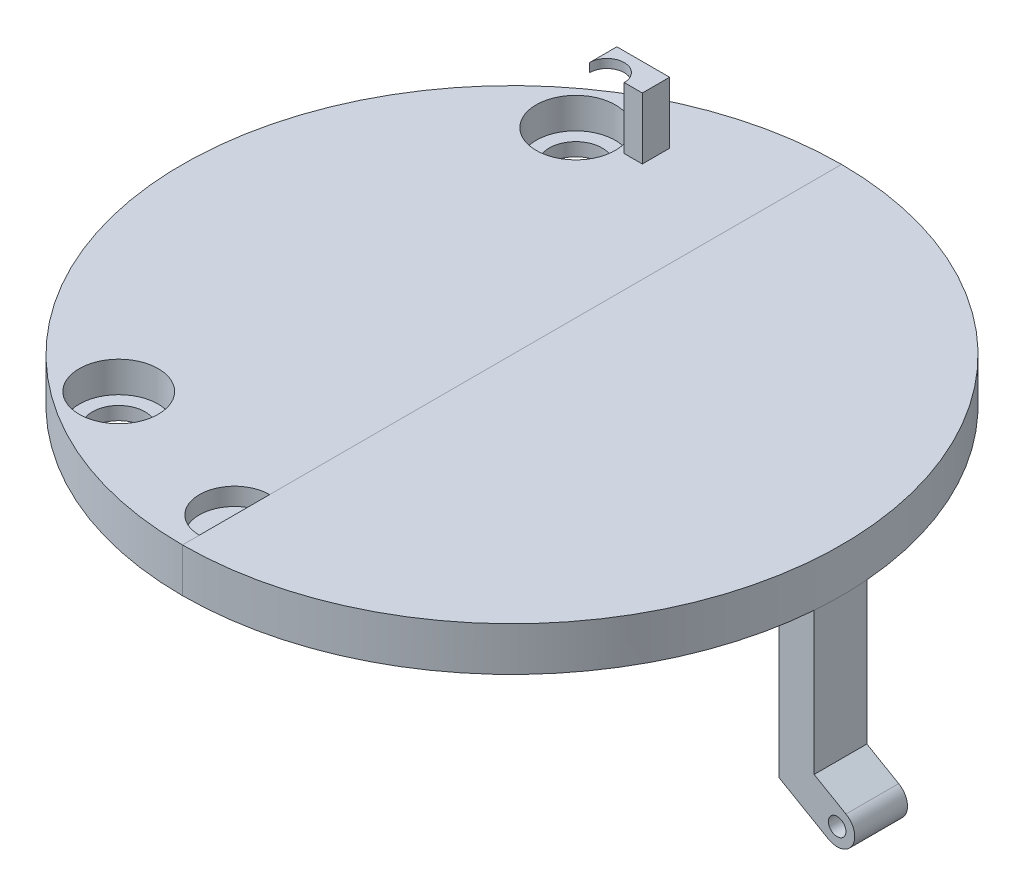
ISO-10303-21;
HEADER;
FILE_DESCRIPTION(('STEP AP214'),'2;1');
FILE_NAME('part.step','',(''),(''),'','','');
FILE_SCHEMA(('AUTOMOTIVE_DESIGN { 1 0 10303 214 1 1 1 1 }'));
ENDSEC;
DATA;
#1=APPLICATION_CONTEXT('core data for automotive mechanical design processes');
#2=APPLICATION_PROTOCOL_DEFINITION('international standard','automotive_design',2000,#1);
#3=PRODUCT_CONTEXT('',#1,'mechanical');
#4=PRODUCT('Part','Part','',(#3));
#5=PRODUCT_RELATED_PRODUCT_CATEGORY('part','',(#4));
#6=PRODUCT_DEFINITION_FORMATION('','',#4);
#7=PRODUCT_DEFINITION_CONTEXT('part definition',#1,'design');
#8=PRODUCT_DEFINITION('design','',#6,#7);
#9=PRODUCT_DEFINITION_SHAPE('','',#8);
#10=(LENGTH_UNIT() NAMED_UNIT(*) SI_UNIT(.MILLI.,.METRE.));
#11=(NAMED_UNIT(*) PLANE_ANGLE_UNIT() SI_UNIT($,.RADIAN.));
#12=(NAMED_UNIT(*) SI_UNIT($,.STERADIAN.) SOLID_ANGLE_UNIT());
#13=UNCERTAINTY_MEASURE_WITH_UNIT(LENGTH_MEASURE(1.E-05),#10,'distance_accuracy_value','');
#14=(GEOMETRIC_REPRESENTATION_CONTEXT(3) GLOBAL_UNCERTAINTY_ASSIGNED_CONTEXT((#13)) GLOBAL_UNIT_ASSIGNED_CONTEXT((#10,
#11,#12)) REPRESENTATION_CONTEXT('',''));
#15=CARTESIAN_POINT('',(0.,0.,0.));
#16=DIRECTION('',(0.,0.,1.));
#17=DIRECTION('',(1.,0.,0.));
#18=AXIS2_PLACEMENT_3D('',#15,#16,#17);
#19=CARTESIAN_POINT('',(13.3482722845565,2.69920297344809,112.500000000023));
#20=DIRECTION('',(0.,-1.,0.));
#21=DIRECTION('',(0.,0.,-1.));
#22=AXIS2_PLACEMENT_3D('',#19,#20,#21);
#23=PLANE('',#22);
#24=DIRECTION('',(0.,0.,-1.));
#25=VECTOR('',#24,1.);
#26=CARTESIAN_POINT('',(13.3482722845565,2.69920297344809,75.0000000000227));
#27=LINE('',#26,#25);
#28=CARTESIAN_POINT('',(13.3482722845565,2.69920297344809,150.000000000023));
#29=VERTEX_POINT('',#28);
#30=CARTESIAN_POINT('',(13.3482722845565,2.69920297344809,148.075126663873));
#31=VERTEX_POINT('',#30);
#32=EDGE_CURVE('P0_E118',#29,#31,#27,.T.);
#33=ORIENTED_EDGE('',*,*,#32,.T.);
#34=CARTESIAN_POINT('',(13.3482722845565,2.69920297344809,144.075126663873));
#35=DIRECTION('',(0.,1.,0.));
#36=DIRECTION('',(0.,0.,1.));
#37=AXIS2_PLACEMENT_3D('',#34,#35,#36);
#38=CIRCLE('',#37,4.);
#39=CARTESIAN_POINT('',(13.3482722845565,2.69920297344809,140.075126663873));
#40=VERTEX_POINT('',#39);
#41=EDGE_CURVE('P0_E107',#40,#31,#38,.T.);
#42=ORIENTED_EDGE('',*,*,#41,.F.);
#43=CARTESIAN_POINT('',(13.3482722845565,2.69920297344809,75.0000000000227));
#44=VERTEX_POINT('',#43);
#45=EDGE_CURVE('P0_E126',#40,#44,#27,.T.);
#46=ORIENTED_EDGE('',*,*,#45,.T.);
#47=CARTESIAN_POINT('',(13.3482722845565,2.69920297344809,112.500000000023));
#48=DIRECTION('',(0.,1.,0.));
#49=DIRECTION('',(0.,0.,-1.));
#50=AXIS2_PLACEMENT_3D('',#47,#48,#49);
#51=CIRCLE('',#50,37.5);
#52=EDGE_CURVE('P0_E123',#44,#29,#51,.T.);
#53=ORIENTED_EDGE('',*,*,#52,.T.);
#54=EDGE_LOOP('',(#33,#42,#46,#53));
#55=FACE_BOUND('',#54,.T.);
#56=CARTESIAN_POINT('',(-5.40172771544353,2.69920297344809,138.500000000023));
#57=DIRECTION('',(0.,1.,0.));
#58=DIRECTION('',(0.,0.,1.));
#59=AXIS2_PLACEMENT_3D('',#56,#57,#58);
#60=CIRCLE('',#59,4.5);
#61=CARTESIAN_POINT('',(-5.40172771544353,2.69920297344809,143.000000000023));
#62=VERTEX_POINT('',#61);
#63=EDGE_CURVE('P0_E293',#62,#62,#60,.T.);
#64=ORIENTED_EDGE('',*,*,#63,.F.);
#65=EDGE_LOOP('',(#64));
#66=FACE_BOUND('',#65,.T.);
#67=CARTESIAN_POINT('',(-5.40172771544354,2.69920297344809,86.5000000000227));
#68=DIRECTION('',(0.,1.,0.));
#69=DIRECTION('',(0.,0.,1.));
#70=AXIS2_PLACEMENT_3D('',#67,#68,#69);
#71=CIRCLE('',#70,4.5);
#72=CARTESIAN_POINT('',(-5.40172771544354,2.69920297344809,91.0000000000227));
#73=VERTEX_POINT('',#72);
#74=EDGE_CURVE('P0_E304',#73,#73,#71,.T.);
#75=ORIENTED_EDGE('',*,*,#74,.F.);
#76=EDGE_LOOP('',(#75));
#77=FACE_BOUND('',#76,.T.);
#78=DIRECTION('',(0.,0.,1.));
#79=VECTOR('',#78,1.);
#80=CARTESIAN_POINT('',(-0.110814287160638,2.69920297344809,83.1916356506288));
#81=LINE('',#80,#79);
#82=CARTESIAN_POINT('',(-0.110814287160638,2.69920297344809,83.1916356506288));
#83=VERTEX_POINT('',#82);
#84=CARTESIAN_POINT('',(-0.110814287160638,2.69920297344809,86.2984068210654));
#85=VERTEX_POINT('',#84);
#86=EDGE_CURVE('P0_E266',#83,#85,#81,.T.);
#87=ORIENTED_EDGE('',*,*,#86,.F.);
#88=DIRECTION('',(-1.,0.,0.));
#89=VECTOR('',#88,1.);
#90=CARTESIAN_POINT('',(1.97494832053114,2.69920297344809,83.1916356506288));
#91=LINE('',#90,#89);
#92=CARTESIAN_POINT('',(1.97494832053114,2.69920297344809,83.1916356506288));
#93=VERTEX_POINT('',#92);
#94=EDGE_CURVE('P0_E271',#93,#83,#91,.T.);
#95=ORIENTED_EDGE('',*,*,#94,.F.);
#96=DIRECTION('',(0.,0.,-1.));
#97=VECTOR('',#96,1.);
#98=CARTESIAN_POINT('',(1.97494832053114,2.69920297344809,83.1916356506288));
#99=LINE('',#98,#97);
#100=CARTESIAN_POINT('',(1.97494832053114,2.69920297344809,86.2984068210654));
#101=VERTEX_POINT('',#100);
#102=EDGE_CURVE('P0_E276',#101,#93,#99,.T.);
#103=ORIENTED_EDGE('',*,*,#102,.F.);
#104=DIRECTION('',(1.,0.,0.));
#105=VECTOR('',#104,1.);
#106=CARTESIAN_POINT('',(-0.110814287160638,2.69920297344809,86.2984068210654));
#107=LINE('',#106,#105);
#108=EDGE_CURVE('P0_E274',#85,#101,#107,.T.);
#109=ORIENTED_EDGE('',*,*,#108,.F.);
#110=EDGE_LOOP('',(#87,#95,#103,#109));
#111=FACE_BOUND('',#110,.T.);
#112=ADVANCED_FACE('P0_F17',(#55,#66,#77,#111),#23,.F.);
#113=CARTESIAN_POINT('',(13.3482722845565,2.69920297344809,112.500000000023));
#114=DIRECTION('',(0.,-1.,0.));
#115=DIRECTION('',(0.,0.,-1.));
#116=AXIS2_PLACEMENT_3D('',#113,#114,#115);
#117=CYLINDRICAL_SURFACE('',#116,37.5);
#118=CARTESIAN_POINT('',(13.3482722845565,-2.30079702655191,112.500000000023));
#119=DIRECTION('',(0.,1.,0.));
#120=DIRECTION('',(0.,0.,-1.));
#121=AXIS2_PLACEMENT_3D('',#118,#119,#120);
#122=CIRCLE('',#121,37.5);
#123=CARTESIAN_POINT('',(13.3482722845565,-2.30079702655191,75.0000000000227));
#124=VERTEX_POINT('',#123);
#125=CARTESIAN_POINT('',(13.3482722845565,-2.30079702655191,150.000000000023));
#126=VERTEX_POINT('',#125);
#127=EDGE_CURVE('P0_E134',#124,#126,#122,.T.);
#128=ORIENTED_EDGE('',*,*,#127,.T.);
#129=DIRECTION('',(0.,-1.,0.));
#130=VECTOR('',#129,1.);
#131=CARTESIAN_POINT('',(13.3482722845565,2.69920297344809,150.000000000023));
#132=LINE('',#131,#130);
#133=EDGE_CURVE('P0_E129',#29,#126,#132,.T.);
#134=ORIENTED_EDGE('',*,*,#133,.F.);
#135=ORIENTED_EDGE('',*,*,#52,.F.);
#136=DIRECTION('',(0.,-1.,0.));
#137=VECTOR('',#136,1.);
#138=CARTESIAN_POINT('',(13.3482722845565,2.69920297344809,75.0000000000227));
#139=LINE('',#138,#137);
#140=EDGE_CURVE('P0_E125',#44,#124,#139,.T.);
#141=ORIENTED_EDGE('',*,*,#140,.T.);
#142=EDGE_LOOP('',(#128,#134,#135,#141));
#143=FACE_BOUND('',#142,.T.);
#144=ADVANCED_FACE('P0_F19',(#143),#117,.T.);
#145=CARTESIAN_POINT('',(13.3482722845565,2.69920297344809,75.0000000000227));
#146=DIRECTION('',(-1.,0.,0.));
#147=DIRECTION('',(0.,0.,1.));
#148=AXIS2_PLACEMENT_3D('',#145,#146,#147);
#149=PLANE('',#148);
#150=DIRECTION('',(0.,0.,-1.));
#151=VECTOR('',#150,1.);
#152=CARTESIAN_POINT('',(13.3482722845565,0.699202973448088,75.0000000000227));
#153=LINE('',#152,#151);
#154=CARTESIAN_POINT('',(13.3482722845565,0.699202973448088,148.075126663873));
#155=VERTEX_POINT('',#154);
#156=CARTESIAN_POINT('',(13.3482722845565,0.699202973448088,140.075126663873));
#157=VERTEX_POINT('',#156);
#158=EDGE_CURVE('P0_E120',#155,#157,#153,.T.);
#159=ORIENTED_EDGE('',*,*,#158,.F.);
#160=DIRECTION('',(0.,1.,0.));
#161=VECTOR('',#160,1.);
#162=CARTESIAN_POINT('',(13.3482722845565,0.699202973448088,148.075126663873));
#163=LINE('',#162,#161);
#164=EDGE_CURVE('P0_E11',#155,#31,#163,.T.);
#165=ORIENTED_EDGE('',*,*,#164,.T.);
#166=ORIENTED_EDGE('',*,*,#32,.F.);
#167=ORIENTED_EDGE('',*,*,#133,.T.);
#168=DIRECTION('',(0.,0.,-1.));
#169=VECTOR('',#168,1.);
#170=CARTESIAN_POINT('',(13.3482722845565,-2.30079702655191,75.0000000000227));
#171=LINE('',#170,#169);
#172=EDGE_CURVE('P0_E137',#126,#124,#171,.T.);
#173=ORIENTED_EDGE('',*,*,#172,.T.);
#174=ORIENTED_EDGE('',*,*,#140,.F.);
#175=ORIENTED_EDGE('',*,*,#45,.F.);
#176=DIRECTION('',(0.,1.,0.));
#177=VECTOR('',#176,1.);
#178=CARTESIAN_POINT('',(13.3482722845565,0.699202973448088,140.075126663873));
#179=LINE('',#178,#177);
#180=EDGE_CURVE('P0_E25',#40,#157,#179,.F.);
#181=ORIENTED_EDGE('',*,*,#180,.T.);
#182=EDGE_LOOP('',(#159,#165,#166,#167,#173,#174,#175,#181));
#183=FACE_BOUND('',#182,.T.);
#184=ADVANCED_FACE('P0_F116',(#183),#149,.F.);
#185=CARTESIAN_POINT('',(13.3482722845565,-2.30079702655191,112.500000000023));
#186=DIRECTION('',(0.,-1.,0.));
#187=DIRECTION('',(0.,0.,-1.));
#188=AXIS2_PLACEMENT_3D('',#185,#186,#187);
#189=PLANE('',#188);
#190=CARTESIAN_POINT('',(-5.40172771544353,-2.30079702655191,138.500000000023));
#191=DIRECTION('',(0.,1.,0.));
#192=DIRECTION('',(0.,0.,1.));
#193=AXIS2_PLACEMENT_3D('',#190,#191,#192);
#194=CIRCLE('',#193,3.);
#195=CARTESIAN_POINT('',(-5.40172771544353,-2.30079702655191,141.500000000023));
#196=VERTEX_POINT('',#195);
#197=EDGE_CURVE('P0_E291',#196,#196,#194,.T.);
#198=ORIENTED_EDGE('',*,*,#197,.T.);
#199=EDGE_LOOP('',(#198));
#200=FACE_BOUND('',#199,.T.);
#201=CARTESIAN_POINT('',(-5.40172771544354,-2.30079702655191,86.5000000000227));
#202=DIRECTION('',(0.,1.,0.));
#203=DIRECTION('',(0.,0.,1.));
#204=AXIS2_PLACEMENT_3D('',#201,#202,#203);
#205=CIRCLE('',#204,3.);
#206=CARTESIAN_POINT('',(-5.40172771544354,-2.30079702655191,89.5000000000227));
#207=VERTEX_POINT('',#206);
#208=EDGE_CURVE('P0_E297',#207,#207,#205,.T.);
#209=ORIENTED_EDGE('',*,*,#208,.T.);
#210=EDGE_LOOP('',(#209));
#211=FACE_BOUND('',#210,.T.);
#212=ORIENTED_EDGE('',*,*,#127,.F.);
#213=ORIENTED_EDGE('',*,*,#172,.F.);
#214=EDGE_LOOP('',(#212,#213));
#215=FACE_BOUND('',#214,.T.);
#216=ADVANCED_FACE('P0_F147',(#200,#211,#215),#189,.T.);
#217=CARTESIAN_POINT('',(-5.40172771544353,-0.800797026551912,138.500000000023));
#218=DIRECTION('',(0.,1.,0.));
#219=DIRECTION('',(0.,0.,1.));
#220=AXIS2_PLACEMENT_3D('',#217,#218,#219);
#221=CYLINDRICAL_SURFACE('',#220,4.5);
#222=CARTESIAN_POINT('',(-5.40172771544353,-0.800797026551912,138.500000000023));
#223=DIRECTION('',(0.,1.,0.));
#224=DIRECTION('',(0.,0.,1.));
#225=AXIS2_PLACEMENT_3D('',#222,#223,#224);
#226=CIRCLE('',#225,4.5);
#227=CARTESIAN_POINT('',(-5.40172771544353,-0.800797026551912,143.000000000023));
#228=VERTEX_POINT('',#227);
#229=EDGE_CURVE('P0_E307',#228,#228,#226,.T.);
#230=ORIENTED_EDGE('',*,*,#229,.F.);
#231=EDGE_LOOP('',(#230));
#232=FACE_BOUND('',#231,.T.);
#233=ORIENTED_EDGE('',*,*,#63,.T.);
#234=EDGE_LOOP('',(#233));
#235=FACE_BOUND('',#234,.T.);
#236=ADVANCED_FACE('P0_F149',(#232,#235),#221,.F.);
#237=CARTESIAN_POINT('',(-5.40172771544353,-0.800797026551912,138.500000000023));
#238=DIRECTION('',(0.,1.,0.));
#239=DIRECTION('',(0.,0.,1.));
#240=AXIS2_PLACEMENT_3D('',#237,#238,#239);
#241=PLANE('',#240);
#242=CARTESIAN_POINT('',(-5.40172771544353,-0.800797026551912,138.500000000023));
#243=DIRECTION('',(0.,1.,0.));
#244=DIRECTION('',(0.,0.,1.));
#245=AXIS2_PLACEMENT_3D('',#242,#243,#244);
#246=CIRCLE('',#245,3.);
#247=CARTESIAN_POINT('',(-5.40172771544353,-0.800797026551912,141.500000000023));
#248=VERTEX_POINT('',#247);
#249=EDGE_CURVE('P0_E294',#248,#248,#246,.T.);
#250=ORIENTED_EDGE('',*,*,#249,.F.);
#251=EDGE_LOOP('',(#250));
#252=FACE_BOUND('',#251,.T.);
#253=ORIENTED_EDGE('',*,*,#229,.T.);
#254=EDGE_LOOP('',(#253));
#255=FACE_BOUND('',#254,.T.);
#256=ADVANCED_FACE('P0_F157',(#252,#255),#241,.T.);
#257=CARTESIAN_POINT('',(-5.40172771544354,-0.800797026551912,86.5000000000227));
#258=DIRECTION('',(0.,1.,0.));
#259=DIRECTION('',(0.,0.,1.));
#260=AXIS2_PLACEMENT_3D('',#257,#258,#259);
#261=CYLINDRICAL_SURFACE('',#260,4.5);
#262=CARTESIAN_POINT('',(-5.40172771544354,-0.800797026551912,86.5000000000227));
#263=DIRECTION('',(0.,1.,0.));
#264=DIRECTION('',(0.,0.,1.));
#265=AXIS2_PLACEMENT_3D('',#262,#263,#264);
#266=CIRCLE('',#265,4.5);
#267=CARTESIAN_POINT('',(-5.40172771544354,-0.800797026551912,91.0000000000227));
#268=VERTEX_POINT('',#267);
#269=EDGE_CURVE('P0_E138',#268,#268,#266,.T.);
#270=ORIENTED_EDGE('',*,*,#269,.F.);
#271=EDGE_LOOP('',(#270));
#272=FACE_BOUND('',#271,.T.);
#273=ORIENTED_EDGE('',*,*,#74,.T.);
#274=EDGE_LOOP('',(#273));
#275=FACE_BOUND('',#274,.T.);
#276=ADVANCED_FACE('P0_F170',(#272,#275),#261,.F.);
#277=CARTESIAN_POINT('',(-5.40172771544354,-0.800797026551912,86.5000000000227));
#278=DIRECTION('',(0.,1.,0.));
#279=DIRECTION('',(0.,0.,1.));
#280=AXIS2_PLACEMENT_3D('',#277,#278,#279);
#281=PLANE('',#280);
#282=CARTESIAN_POINT('',(-5.40172771544354,-0.800797026551912,86.5000000000227));
#283=DIRECTION('',(0.,1.,0.));
#284=DIRECTION('',(0.,0.,1.));
#285=AXIS2_PLACEMENT_3D('',#282,#283,#284);
#286=CIRCLE('',#285,3.);
#287=CARTESIAN_POINT('',(-5.40172771544354,-0.800797026551912,89.5000000000227));
#288=VERTEX_POINT('',#287);
#289=EDGE_CURVE('P0_E290',#288,#288,#286,.T.);
#290=ORIENTED_EDGE('',*,*,#289,.F.);
#291=EDGE_LOOP('',(#290));
#292=FACE_BOUND('',#291,.T.);
#293=ORIENTED_EDGE('',*,*,#269,.T.);
#294=EDGE_LOOP('',(#293));
#295=FACE_BOUND('',#294,.T.);
#296=ADVANCED_FACE('P0_F174',(#292,#295),#281,.T.);
#297=CARTESIAN_POINT('',(-5.40172771544354,-2.30079702655191,86.5000000000227));
#298=DIRECTION('',(0.,1.,0.));
#299=DIRECTION('',(0.,0.,1.));
#300=AXIS2_PLACEMENT_3D('',#297,#298,#299);
#301=CYLINDRICAL_SURFACE('',#300,3.);
#302=ORIENTED_EDGE('',*,*,#208,.F.);
#303=EDGE_LOOP('',(#302));
#304=FACE_BOUND('',#303,.T.);
#305=ORIENTED_EDGE('',*,*,#289,.T.);
#306=EDGE_LOOP('',(#305));
#307=FACE_BOUND('',#306,.T.);
#308=ADVANCED_FACE('P0_F178',(#304,#307),#301,.F.);
#309=CARTESIAN_POINT('',(-5.40172771544353,-2.30079702655191,138.500000000023));
#310=DIRECTION('',(0.,1.,0.));
#311=DIRECTION('',(0.,0.,1.));
#312=AXIS2_PLACEMENT_3D('',#309,#310,#311);
#313=CYLINDRICAL_SURFACE('',#312,3.);
#314=ORIENTED_EDGE('',*,*,#197,.F.);
#315=EDGE_LOOP('',(#314));
#316=FACE_BOUND('',#315,.T.);
#317=ORIENTED_EDGE('',*,*,#249,.T.);
#318=EDGE_LOOP('',(#317));
#319=FACE_BOUND('',#318,.T.);
#320=ADVANCED_FACE('P0_F182',(#316,#319),#313,.F.);
#321=CARTESIAN_POINT('',(-0.110814287160638,8.69920297344809,83.1916356506288));
#322=DIRECTION('',(1.,0.,0.));
#323=DIRECTION('',(0.,0.,-1.));
#324=AXIS2_PLACEMENT_3D('',#321,#322,#323);
#325=PLANE('',#324);
#326=DIRECTION('',(0.,0.,1.));
#327=VECTOR('',#326,1.);
#328=CARTESIAN_POINT('',(-0.110814287160638,4.69920297344809,83.1916356506288));
#329=LINE('',#328,#327);
#330=CARTESIAN_POINT('',(-0.110814287160638,4.69920297344809,85.961270977815));
#331=VERTEX_POINT('',#330);
#332=CARTESIAN_POINT('',(-0.110814287160638,4.69920297344809,86.2984068210654));
#333=VERTEX_POINT('',#332);
#334=EDGE_CURVE('P0_E243',#331,#333,#329,.T.);
#335=ORIENTED_EDGE('',*,*,#334,.F.);
#336=DIRECTION('',(0.,1.,0.));
#337=VECTOR('',#336,1.);
#338=CARTESIAN_POINT('',(-0.110814287160638,4.69920297344809,85.961270977815));
#339=LINE('',#338,#337);
#340=CARTESIAN_POINT('',(-0.110814287160638,8.69920297344809,85.961270977815));
#341=VERTEX_POINT('',#340);
#342=EDGE_CURVE('P0_E240',#331,#341,#339,.T.);
#343=ORIENTED_EDGE('',*,*,#342,.T.);
#344=DIRECTION('',(0.,0.,1.));
#345=VECTOR('',#344,1.);
#346=CARTESIAN_POINT('',(-0.110814287160638,8.69920297344809,83.1916356506288));
#347=LINE('',#346,#345);
#348=CARTESIAN_POINT('',(-0.110814287160638,8.69920297344809,83.1916356506288));
#349=VERTEX_POINT('',#348);
#350=EDGE_CURVE('P0_E267',#349,#341,#347,.T.);
#351=ORIENTED_EDGE('',*,*,#350,.F.);
#352=DIRECTION('',(0.,-1.,0.));
#353=VECTOR('',#352,1.);
#354=CARTESIAN_POINT('',(-0.110814287160638,8.69920297344809,83.1916356506288));
#355=LINE('',#354,#353);
#356=EDGE_CURVE('P0_E270',#349,#83,#355,.T.);
#357=ORIENTED_EDGE('',*,*,#356,.T.);
#358=ORIENTED_EDGE('',*,*,#86,.T.);
#359=DIRECTION('',(0.,-1.,0.));
#360=VECTOR('',#359,1.);
#361=CARTESIAN_POINT('',(-0.110814287160638,8.69920297344809,86.2984068210654));
#362=LINE('',#361,#360);
#363=EDGE_CURVE('P0_E39',#333,#85,#362,.T.);
#364=ORIENTED_EDGE('',*,*,#363,.F.);
#365=EDGE_LOOP('',(#335,#343,#351,#357,#358,#364));
#366=FACE_BOUND('',#365,.T.);
#367=ADVANCED_FACE('P0_F186',(#366),#325,.F.);
#368=CARTESIAN_POINT('',(-0.110814287160638,8.69920297344809,86.2984068210654));
#369=DIRECTION('',(0.,0.,-1.));
#370=DIRECTION('',(-1.,0.,0.));
#371=AXIS2_PLACEMENT_3D('',#368,#369,#370);
#372=PLANE('',#371);
#373=DIRECTION('',(1.,0.,0.));
#374=VECTOR('',#373,1.);
#375=CARTESIAN_POINT('',(1.97494832053114,9.69920297344809,86.2984068210654));
#376=LINE('',#375,#374);
#377=CARTESIAN_POINT('',(-0.0817765550528392,9.69920297344809,86.2984068210654));
#378=VERTEX_POINT('',#377);
#379=CARTESIAN_POINT('',(1.97494832053114,9.69920297344809,86.2984068210654));
#380=VERTEX_POINT('',#379);
#381=EDGE_CURVE('P0_E253',#378,#380,#376,.T.);
#382=ORIENTED_EDGE('',*,*,#381,.F.);
#383=DIRECTION('',(0.,1.,0.));
#384=VECTOR('',#383,1.);
#385=CARTESIAN_POINT('',(-0.0817765550528392,4.69920297344809,86.2984068210654));
#386=LINE('',#385,#384);
#387=CARTESIAN_POINT('',(-0.0817765550528392,4.69920297344809,86.2984068210654));
#388=VERTEX_POINT('',#387);
#389=EDGE_CURVE('P0_E237',#388,#378,#386,.T.);
#390=ORIENTED_EDGE('',*,*,#389,.F.);
#391=DIRECTION('',(1.,0.,0.));
#392=VECTOR('',#391,1.);
#393=CARTESIAN_POINT('',(-4.02505167946886,4.69920297344809,86.2984068210654));
#394=LINE('',#393,#392);
#395=EDGE_CURVE('P0_E236',#333,#388,#394,.T.);
#396=ORIENTED_EDGE('',*,*,#395,.F.);
#397=ORIENTED_EDGE('',*,*,#363,.T.);
#398=ORIENTED_EDGE('',*,*,#108,.T.);
#399=DIRECTION('',(0.,-1.,0.));
#400=VECTOR('',#399,1.);
#401=CARTESIAN_POINT('',(1.97494832053114,8.69920297344809,86.2984068210654));
#402=LINE('',#401,#400);
#403=EDGE_CURVE('P0_E286',#380,#101,#402,.T.);
#404=ORIENTED_EDGE('',*,*,#403,.F.);
#405=EDGE_LOOP('',(#382,#390,#396,#397,#398,#404));
#406=FACE_BOUND('',#405,.T.);
#407=ADVANCED_FACE('P0_F190',(#406),#372,.F.);
#408=CARTESIAN_POINT('',(1.97494832053114,8.69920297344809,83.1916356506288));
#409=DIRECTION('',(-1.,0.,0.));
#410=DIRECTION('',(0.,0.,1.));
#411=AXIS2_PLACEMENT_3D('',#408,#409,#410);
#412=PLANE('',#411);
#413=ORIENTED_EDGE('',*,*,#102,.T.);
#414=DIRECTION('',(0.,-1.,0.));
#415=VECTOR('',#414,1.);
#416=CARTESIAN_POINT('',(1.97494832053114,8.69920297344809,83.1916356506288));
#417=LINE('',#416,#415);
#418=CARTESIAN_POINT('',(1.97494832053114,9.69920297344809,83.1916356506288));
#419=VERTEX_POINT('',#418);
#420=EDGE_CURVE('P0_E283',#419,#93,#417,.T.);
#421=ORIENTED_EDGE('',*,*,#420,.F.);
#422=DIRECTION('',(0.,0.,-1.));
#423=VECTOR('',#422,1.);
#424=CARTESIAN_POINT('',(1.97494832053114,9.69920297344809,83.1916356506288));
#425=LINE('',#424,#423);
#426=EDGE_CURVE('P0_E255',#380,#419,#425,.T.);
#427=ORIENTED_EDGE('',*,*,#426,.F.);
#428=ORIENTED_EDGE('',*,*,#403,.T.);
#429=EDGE_LOOP('',(#413,#421,#427,#428));
#430=FACE_BOUND('',#429,.T.);
#431=ADVANCED_FACE('P0_F194',(#430),#412,.F.);
#432=CARTESIAN_POINT('',(1.97494832053114,8.69920297344809,83.1916356506288));
#433=DIRECTION('',(0.,0.,1.));
#434=DIRECTION('',(1.,0.,0.));
#435=AXIS2_PLACEMENT_3D('',#432,#433,#434);
#436=PLANE('',#435);
#437=ORIENTED_EDGE('',*,*,#94,.T.);
#438=ORIENTED_EDGE('',*,*,#356,.F.);
#439=DIRECTION('',(-1.,0.,0.));
#440=VECTOR('',#439,1.);
#441=CARTESIAN_POINT('',(-4.02505167946886,8.69920297344809,83.1916356506288));
#442=LINE('',#441,#440);
#443=CARTESIAN_POINT('',(-4.02505167946886,8.69920297344809,83.1916356506288));
#444=VERTEX_POINT('',#443);
#445=EDGE_CURVE('P0_E245',#349,#444,#442,.T.);
#446=ORIENTED_EDGE('',*,*,#445,.T.);
#447=DIRECTION('',(0.,-1.,0.));
#448=VECTOR('',#447,1.);
#449=CARTESIAN_POINT('',(-4.02505167946886,9.69920297344809,83.1916356506288));
#450=LINE('',#449,#448);
#451=CARTESIAN_POINT('',(-4.02505167946886,9.69920297344809,83.1916356506288));
#452=VERTEX_POINT('',#451);
#453=EDGE_CURVE('P0_E263',#452,#444,#450,.T.);
#454=ORIENTED_EDGE('',*,*,#453,.F.);
#455=DIRECTION('',(-1.,0.,0.));
#456=VECTOR('',#455,1.);
#457=CARTESIAN_POINT('',(-4.02505167946886,9.69920297344809,83.1916356506288));
#458=LINE('',#457,#456);
#459=EDGE_CURVE('P0_E246',#419,#452,#458,.T.);
#460=ORIENTED_EDGE('',*,*,#459,.F.);
#461=ORIENTED_EDGE('',*,*,#420,.T.);
#462=EDGE_LOOP('',(#437,#438,#446,#454,#460,#461));
#463=FACE_BOUND('',#462,.T.);
#464=ADVANCED_FACE('P0_F197',(#463),#436,.F.);
#465=CARTESIAN_POINT('',(-4.02505167946886,9.69920297344809,86.2984068210654));
#466=DIRECTION('',(1.,0.,0.));
#467=DIRECTION('',(0.,0.,-1.));
#468=AXIS2_PLACEMENT_3D('',#465,#466,#467);
#469=PLANE('',#468);
#470=DIRECTION('',(0.,0.,1.));
#471=VECTOR('',#470,1.);
#472=CARTESIAN_POINT('',(-4.02505167946886,8.69920297344809,86.2984068210654));
#473=LINE('',#472,#471);
#474=CARTESIAN_POINT('',(-4.02505167946886,8.69920297344809,86.2984068210654));
#475=VERTEX_POINT('',#474);
#476=EDGE_CURVE('P0_E250',#444,#475,#473,.T.);
#477=ORIENTED_EDGE('',*,*,#476,.T.);
#478=DIRECTION('',(0.,-1.,0.));
#479=VECTOR('',#478,1.);
#480=CARTESIAN_POINT('',(-4.02505167946886,9.69920297344809,86.2984068210654));
#481=LINE('',#480,#479);
#482=CARTESIAN_POINT('',(-4.02505167946886,9.69920297344809,86.2984068210654));
#483=VERTEX_POINT('',#482);
#484=EDGE_CURVE('P0_E258',#483,#475,#481,.T.);
#485=ORIENTED_EDGE('',*,*,#484,.F.);
#486=DIRECTION('',(0.,0.,1.));
#487=VECTOR('',#486,1.);
#488=CARTESIAN_POINT('',(-4.02505167946886,9.69920297344809,86.2984068210654));
#489=LINE('',#488,#487);
#490=EDGE_CURVE('P0_E249',#452,#483,#489,.T.);
#491=ORIENTED_EDGE('',*,*,#490,.F.);
#492=ORIENTED_EDGE('',*,*,#453,.T.);
#493=EDGE_LOOP('',(#477,#485,#491,#492));
#494=FACE_BOUND('',#493,.T.);
#495=ADVANCED_FACE('P0_F201',(#494),#469,.F.);
#496=CARTESIAN_POINT('',(13.3482722845565,9.69920297344809,75.0000000000227));
#497=DIRECTION('',(0.,-1.,0.));
#498=DIRECTION('',(0.,0.,-1.));
#499=AXIS2_PLACEMENT_3D('',#496,#497,#498);
#500=PLANE('',#499);
#501=ORIENTED_EDGE('',*,*,#490,.T.);
#502=CARTESIAN_POINT('',(-2.05341411726085,9.69920297344809,86.2984068210654));
#503=DIRECTION('',(0.,1.,0.));
#504=DIRECTION('',(0.,0.,1.));
#505=AXIS2_PLACEMENT_3D('',#502,#503,#504);
#506=CIRCLE('',#505,1.97163756220801);
#507=EDGE_CURVE('P0_E229',#378,#483,#506,.T.);
#508=ORIENTED_EDGE('',*,*,#507,.F.);
#509=ORIENTED_EDGE('',*,*,#381,.T.);
#510=ORIENTED_EDGE('',*,*,#426,.T.);
#511=ORIENTED_EDGE('',*,*,#459,.T.);
#512=EDGE_LOOP('',(#501,#508,#509,#510,#511));
#513=FACE_BOUND('',#512,.T.);
#514=ADVANCED_FACE('P0_F205',(#513),#500,.F.);
#515=CARTESIAN_POINT('',(13.3482722845565,8.69920297344809,75.0000000000227));
#516=DIRECTION('',(0.,-1.,0.));
#517=DIRECTION('',(0.,0.,-1.));
#518=AXIS2_PLACEMENT_3D('',#515,#516,#517);
#519=PLANE('',#518);
#520=CARTESIAN_POINT('',(-2.05341411726085,8.69920297344809,86.2984068210654));
#521=DIRECTION('',(0.,-1.,0.));
#522=DIRECTION('',(0.,0.,-1.));
#523=AXIS2_PLACEMENT_3D('',#520,#521,#522);
#524=CIRCLE('',#523,1.97163756220801);
#525=EDGE_CURVE('P0_E141',#475,#341,#524,.T.);
#526=ORIENTED_EDGE('',*,*,#525,.F.);
#527=ORIENTED_EDGE('',*,*,#476,.F.);
#528=ORIENTED_EDGE('',*,*,#445,.F.);
#529=ORIENTED_EDGE('',*,*,#350,.T.);
#530=EDGE_LOOP('',(#526,#527,#528,#529));
#531=FACE_BOUND('',#530,.T.);
#532=ADVANCED_FACE('P0_F207',(#531),#519,.T.);
#533=CARTESIAN_POINT('',(-2.05341411726085,4.69920297344809,86.2984068210654));
#534=DIRECTION('',(0.,1.,0.));
#535=DIRECTION('',(0.,0.,1.));
#536=AXIS2_PLACEMENT_3D('',#533,#534,#535);
#537=PLANE('',#536);
#538=ORIENTED_EDGE('',*,*,#334,.T.);
#539=ORIENTED_EDGE('',*,*,#395,.T.);
#540=CARTESIAN_POINT('',(-2.05341411726085,4.69920297344809,86.2984068210654));
#541=DIRECTION('',(0.,1.,0.));
#542=DIRECTION('',(0.,0.,1.));
#543=AXIS2_PLACEMENT_3D('',#540,#541,#542);
#544=CIRCLE('',#543,1.97163756220801);
#545=EDGE_CURVE('P0_E231',#388,#331,#544,.T.);
#546=ORIENTED_EDGE('',*,*,#545,.T.);
#547=EDGE_LOOP('',(#538,#539,#546));
#548=FACE_BOUND('',#547,.T.);
#549=ADVANCED_FACE('P0_F210',(#548),#537,.T.);
#550=CARTESIAN_POINT('',(-2.05341411726085,4.69920297344809,86.2984068210654));
#551=DIRECTION('',(0.,1.,0.));
#552=DIRECTION('',(0.,0.,1.));
#553=AXIS2_PLACEMENT_3D('',#550,#551,#552);
#554=CYLINDRICAL_SURFACE('',#553,1.97163756220801);
#555=ORIENTED_EDGE('',*,*,#545,.F.);
#556=ORIENTED_EDGE('',*,*,#389,.T.);
#557=ORIENTED_EDGE('',*,*,#507,.T.);
#558=ORIENTED_EDGE('',*,*,#484,.T.);
#559=ORIENTED_EDGE('',*,*,#525,.T.);
#560=ORIENTED_EDGE('',*,*,#342,.F.);
#561=EDGE_LOOP('',(#555,#556,#557,#558,#559,#560));
#562=FACE_BOUND('',#561,.T.);
#563=ADVANCED_FACE('P0_F215',(#562),#554,.F.);
#564=CARTESIAN_POINT('',(13.3482722845565,0.699202973448088,144.075126663873));
#565=DIRECTION('',(0.,1.,0.));
#566=DIRECTION('',(0.,0.,1.));
#567=AXIS2_PLACEMENT_3D('',#564,#565,#566);
#568=CYLINDRICAL_SURFACE('',#567,4.);
#569=CARTESIAN_POINT('',(13.3482722845565,0.699202973448088,144.075126663873));
#570=DIRECTION('',(0.,1.,0.));
#571=DIRECTION('',(0.,0.,1.));
#572=AXIS2_PLACEMENT_3D('',#569,#570,#571);
#573=CIRCLE('',#572,4.);
#574=EDGE_CURVE('P0_E31',#157,#155,#573,.T.);
#575=ORIENTED_EDGE('',*,*,#574,.F.);
#576=ORIENTED_EDGE('',*,*,#180,.F.);
#577=ORIENTED_EDGE('',*,*,#41,.T.);
#578=ORIENTED_EDGE('',*,*,#164,.F.);
#579=EDGE_LOOP('',(#575,#576,#577,#578));
#580=FACE_BOUND('',#579,.T.);
#581=ADVANCED_FACE('P0_F108',(#580),#568,.F.);
#582=CARTESIAN_POINT('',(13.3482722845565,0.699202973448088,144.075126663873));
#583=DIRECTION('',(0.,1.,0.));
#584=DIRECTION('',(0.,0.,1.));
#585=AXIS2_PLACEMENT_3D('',#582,#583,#584);
#586=PLANE('',#585);
#587=ORIENTED_EDGE('',*,*,#158,.T.);
#588=ORIENTED_EDGE('',*,*,#574,.T.);
#589=EDGE_LOOP('',(#587,#588));
#590=FACE_BOUND('',#589,.T.);
#591=ADVANCED_FACE('P0_F224',(#590),#586,.T.);
#592=CLOSED_SHELL('',(#112,#144,#184,#216,#236,#256,#276,#296,#308,#320,#367,#407,#431,#464,
#495,#514,#532,#549,#563,#581,#591));
#593=MANIFOLD_SOLID_BREP('P0_B1',#592);
#594=CARTESIAN_POINT('',(13.3482722845565,-2.30079702655191,112.500000000023));
#595=DIRECTION('',(0.,1.,0.));
#596=DIRECTION('',(0.,0.,1.));
#597=AXIS2_PLACEMENT_3D('',#594,#595,#596);
#598=PLANE('',#597);
#599=DIRECTION('',(0.,0.,1.));
#600=VECTOR('',#599,1.);
#601=CARTESIAN_POINT('',(50.7280796676878,-2.30079702655191,109.500000000023));
#602=LINE('',#601,#600);
#603=CARTESIAN_POINT('',(50.7280796676878,-2.30079702655191,109.500000000023));
#604=VERTEX_POINT('',#603);
#605=CARTESIAN_POINT('',(50.7280796676878,-2.30079702655191,115.500000000023));
#606=VERTEX_POINT('',#605);
#607=EDGE_CURVE('P1_E73',#604,#606,#602,.T.);
#608=ORIENTED_EDGE('',*,*,#607,.F.);
#609=CARTESIAN_POINT('',(13.3482722845565,-2.30079702655191,112.500000000023));
#610=DIRECTION('',(0.,1.,0.));
#611=DIRECTION('',(0.,0.,1.));
#612=AXIS2_PLACEMENT_3D('',#609,#610,#611);
#613=CIRCLE('',#612,37.5);
#614=EDGE_CURVE('P1_E69',#606,#604,#613,.T.);
#615=ORIENTED_EDGE('',*,*,#614,.F.);
#616=EDGE_LOOP('',(#608,#615));
#617=FACE_BOUND('',#616,.T.);
#618=ADVANCED_FACE('P1_F16',(#617),#598,.F.);
#619=CARTESIAN_POINT('',(13.3482722845565,2.69920297344809,112.500000000023));
#620=DIRECTION('',(0.,-1.,0.));
#621=DIRECTION('',(0.,0.,-1.));
#622=AXIS2_PLACEMENT_3D('',#619,#620,#621);
#623=CYLINDRICAL_SURFACE('',#622,37.5);
#624=CARTESIAN_POINT('',(13.3482722845565,-2.30079702655191,150.000000000023));
#625=VERTEX_POINT('',#624);
#626=EDGE_CURVE('P1_E60',#625,#606,#613,.T.);
#627=ORIENTED_EDGE('',*,*,#626,.T.);
#628=ORIENTED_EDGE('',*,*,#614,.T.);
#629=CARTESIAN_POINT('',(13.3482722845565,-2.30079702655191,75.0000000000227));
#630=VERTEX_POINT('',#629);
#631=EDGE_CURVE('P1_E71',#604,#630,#613,.T.);
#632=ORIENTED_EDGE('',*,*,#631,.T.);
#633=DIRECTION('',(0.,-1.,0.));
#634=VECTOR('',#633,1.);
#635=CARTESIAN_POINT('',(13.3482722845565,2.69920297344809,75.0000000000227));
#636=LINE('',#635,#634);
#637=CARTESIAN_POINT('',(13.3482722845565,2.69920297344809,75.0000000000227));
#638=VERTEX_POINT('',#637);
#639=EDGE_CURVE('P1_E10',#638,#630,#636,.T.);
#640=ORIENTED_EDGE('',*,*,#639,.F.);
#641=CARTESIAN_POINT('',(13.3482722845565,2.69920297344809,112.500000000023));
#642=DIRECTION('',(0.,1.,0.));
#643=DIRECTION('',(0.,0.,1.));
#644=AXIS2_PLACEMENT_3D('',#641,#642,#643);
#645=CIRCLE('',#644,37.5);
#646=CARTESIAN_POINT('',(13.3482722845565,2.69920297344809,150.000000000023));
#647=VERTEX_POINT('',#646);
#648=EDGE_CURVE('P1_E59',#647,#638,#645,.T.);
#649=ORIENTED_EDGE('',*,*,#648,.F.);
#650=DIRECTION('',(0.,-1.,0.));
#651=VECTOR('',#650,1.);
#652=CARTESIAN_POINT('',(13.3482722845565,2.69920297344809,150.000000000023));
#653=LINE('',#652,#651);
#654=EDGE_CURVE('P1_E24',#647,#625,#653,.T.);
#655=ORIENTED_EDGE('',*,*,#654,.T.);
#656=EDGE_LOOP('',(#627,#628,#632,#640,#649,#655));
#657=FACE_BOUND('',#656,.T.);
#658=ADVANCED_FACE('P1_F18',(#657),#623,.T.);
#659=CARTESIAN_POINT('',(13.3482722845565,2.69920297344809,75.0000000000227));
#660=DIRECTION('',(1.,0.,0.));
#661=DIRECTION('',(0.,0.,-1.));
#662=AXIS2_PLACEMENT_3D('',#659,#660,#661);
#663=PLANE('',#662);
#664=DIRECTION('',(0.,0.,1.));
#665=VECTOR('',#664,1.);
#666=CARTESIAN_POINT('',(13.3482722845565,-2.30079702655191,75.0000000000227));
#667=LINE('',#666,#665);
#668=EDGE_CURVE('P1_E51',#630,#625,#667,.T.);
#669=ORIENTED_EDGE('',*,*,#668,.T.);
#670=ORIENTED_EDGE('',*,*,#654,.F.);
#671=DIRECTION('',(0.,0.,1.));
#672=VECTOR('',#671,1.);
#673=CARTESIAN_POINT('',(13.3482722845565,2.69920297344809,75.0000000000227));
#674=LINE('',#673,#672);
#675=EDGE_CURVE('P1_E39',#638,#647,#674,.T.);
#676=ORIENTED_EDGE('',*,*,#675,.F.);
#677=ORIENTED_EDGE('',*,*,#639,.T.);
#678=EDGE_LOOP('',(#669,#670,#676,#677));
#679=FACE_BOUND('',#678,.T.);
#680=ADVANCED_FACE('P1_F53',(#679),#663,.F.);
#681=CARTESIAN_POINT('',(13.3482722845565,2.69920297344809,112.500000000023));
#682=DIRECTION('',(0.,1.,0.));
#683=DIRECTION('',(0.,0.,1.));
#684=AXIS2_PLACEMENT_3D('',#681,#682,#683);
#685=PLANE('',#684);
#686=ORIENTED_EDGE('',*,*,#648,.T.);
#687=ORIENTED_EDGE('',*,*,#675,.T.);
#688=EDGE_LOOP('',(#686,#687));
#689=FACE_BOUND('',#688,.T.);
#690=ADVANCED_FACE('P1_F86',(#689),#685,.T.);
#691=DIRECTION('',(0.,0.,1.));
#692=VECTOR('',#691,1.);
#693=CARTESIAN_POINT('',(46.7280796676878,-2.30079702655191,109.500000000023));
#694=LINE('',#693,#692);
#695=CARTESIAN_POINT('',(46.7280796676878,-2.30079702655191,109.500000000023));
#696=VERTEX_POINT('',#695);
#697=CARTESIAN_POINT('',(46.7280796676878,-2.30079702655191,115.500000000023));
#698=VERTEX_POINT('',#697);
#699=EDGE_CURVE('P1_E110',#696,#698,#694,.T.);
#700=ORIENTED_EDGE('',*,*,#699,.T.);
#701=DIRECTION('',(1.,0.,0.));
#702=VECTOR('',#701,1.);
#703=CARTESIAN_POINT('',(46.7280796676878,-2.30079702655191,115.500000000023));
#704=LINE('',#703,#702);
#705=EDGE_CURVE('P1_E31',#698,#606,#704,.T.);
#706=ORIENTED_EDGE('',*,*,#705,.T.);
#707=ORIENTED_EDGE('',*,*,#626,.F.);
#708=ORIENTED_EDGE('',*,*,#668,.F.);
#709=ORIENTED_EDGE('',*,*,#631,.F.);
#710=DIRECTION('',(1.,0.,0.));
#711=VECTOR('',#710,1.);
#712=CARTESIAN_POINT('',(46.7280796676878,-2.30079702655191,109.500000000023));
#713=LINE('',#712,#711);
#714=EDGE_CURVE('P1_E108',#696,#604,#713,.T.);
#715=ORIENTED_EDGE('',*,*,#714,.F.);
#716=EDGE_LOOP('',(#700,#706,#707,#708,#709,#715));
#717=FACE_BOUND('',#716,.T.);
#718=ADVANCED_FACE('P1_F67',(#717),#598,.F.);
#719=CARTESIAN_POINT('',(50.7280796676878,-2.30079702655191,109.500000000023));
#720=DIRECTION('',(-1.,0.,0.));
#721=DIRECTION('',(0.,0.,1.));
#722=AXIS2_PLACEMENT_3D('',#719,#720,#721);
#723=PLANE('',#722);
#724=DIRECTION('',(0.,-1.,0.));
#725=VECTOR('',#724,1.);
#726=CARTESIAN_POINT('',(50.7280796676878,-2.30079702655191,115.500000000023));
#727=LINE('',#726,#725);
#728=CARTESIAN_POINT('',(50.7280796676878,-18.4786270371156,115.500000000023));
#729=VERTEX_POINT('',#728);
#730=EDGE_CURVE('P1_E138',#606,#729,#727,.T.);
#731=ORIENTED_EDGE('',*,*,#730,.T.);
#732=DIRECTION('',(0.,0.,1.));
#733=VECTOR('',#732,1.);
#734=CARTESIAN_POINT('',(50.7280796676878,-18.4786270371156,109.500000000023));
#735=LINE('',#734,#733);
#736=CARTESIAN_POINT('',(50.7280796676878,-18.4786270371156,109.500000000023));
#737=VERTEX_POINT('',#736);
#738=EDGE_CURVE('P1_E75',#737,#729,#735,.T.);
#739=ORIENTED_EDGE('',*,*,#738,.F.);
#740=DIRECTION('',(0.,-1.,0.));
#741=VECTOR('',#740,1.);
#742=CARTESIAN_POINT('',(50.7280796676878,-2.30079702655191,109.500000000023));
#743=LINE('',#742,#741);
#744=EDGE_CURVE('P1_E116',#604,#737,#743,.T.);
#745=ORIENTED_EDGE('',*,*,#744,.F.);
#746=ORIENTED_EDGE('',*,*,#607,.T.);
#747=EDGE_LOOP('',(#731,#739,#745,#746));
#748=FACE_BOUND('',#747,.T.);
#749=ADVANCED_FACE('P1_F94',(#748),#723,.F.);
#750=CARTESIAN_POINT('',(50.7280796676878,-18.4786270371156,109.500000000023));
#751=DIRECTION('',(-0.499999999999998,-0.86602540378444,0.));
#752=DIRECTION('',(0.86602540378444,-0.499999999999998,0.));
#753=AXIS2_PLACEMENT_3D('',#750,#751,#752);
#754=PLANE('',#753);
#755=DIRECTION('',(0.86602540378444,-0.499999999999998,0.));
#756=VECTOR('',#755,1.);
#757=CARTESIAN_POINT('',(50.7280796676878,-18.4786270371156,115.500000000023));
#758=LINE('',#757,#756);
#759=CARTESIAN_POINT('',(54.3482722845565,-20.568746218983,115.500000000023));
#760=VERTEX_POINT('',#759);
#761=EDGE_CURVE('P1_E140',#729,#760,#758,.T.);
#762=ORIENTED_EDGE('',*,*,#761,.T.);
#763=DIRECTION('',(0.,0.,1.));
#764=VECTOR('',#763,1.);
#765=CARTESIAN_POINT('',(54.3482722845565,-20.568746218983,109.500000000023));
#766=LINE('',#765,#764);
#767=CARTESIAN_POINT('',(54.3482722845565,-20.568746218983,109.500000000023));
#768=VERTEX_POINT('',#767);
#769=EDGE_CURVE('P1_E82',#768,#760,#766,.T.);
#770=ORIENTED_EDGE('',*,*,#769,.F.);
#771=DIRECTION('',(0.86602540378444,-0.499999999999998,0.));
#772=VECTOR('',#771,1.);
#773=CARTESIAN_POINT('',(50.7280796676878,-18.4786270371156,109.500000000023));
#774=LINE('',#773,#772);
#775=EDGE_CURVE('P1_E119',#737,#768,#774,.T.);
#776=ORIENTED_EDGE('',*,*,#775,.F.);
#777=ORIENTED_EDGE('',*,*,#738,.T.);
#778=EDGE_LOOP('',(#762,#770,#776,#777));
#779=FACE_BOUND('',#778,.T.);
#780=ADVANCED_FACE('P1_F169',(#779),#754,.F.);
#781=CARTESIAN_POINT('',(53.3482722845565,-22.3007970265519,109.500000000023));
#782=DIRECTION('',(0.,0.,1.));
#783=DIRECTION('',(1.,0.,0.));
#784=AXIS2_PLACEMENT_3D('',#781,#782,#783);
#785=CYLINDRICAL_SURFACE('',#784,2.);
#786=CARTESIAN_POINT('',(53.3482722845565,-22.3007970265519,115.500000000023));
#787=DIRECTION('',(0.,0.,1.));
#788=DIRECTION('',(1.,0.,0.));
#789=AXIS2_PLACEMENT_3D('',#786,#787,#788);
#790=CIRCLE('',#789,2.);
#791=CARTESIAN_POINT('',(52.3482722845565,-24.0328478341208,115.500000000023));
#792=VERTEX_POINT('',#791);
#793=EDGE_CURVE('P1_E143',#792,#760,#790,.T.);
#794=ORIENTED_EDGE('',*,*,#793,.F.);
#795=DIRECTION('',(0.,0.,1.));
#796=VECTOR('',#795,1.);
#797=CARTESIAN_POINT('',(52.3482722845565,-24.0328478341208,109.500000000023));
#798=LINE('',#797,#796);
#799=CARTESIAN_POINT('',(52.3482722845565,-24.0328478341208,109.500000000023));
#800=VERTEX_POINT('',#799);
#801=EDGE_CURVE('P1_E152',#800,#792,#798,.T.);
#802=ORIENTED_EDGE('',*,*,#801,.F.);
#803=CARTESIAN_POINT('',(53.3482722845565,-22.3007970265519,109.500000000023));
#804=DIRECTION('',(0.,0.,1.));
#805=DIRECTION('',(1.,0.,0.));
#806=AXIS2_PLACEMENT_3D('',#803,#804,#805);
#807=CIRCLE('',#806,2.);
#808=EDGE_CURVE('P1_E129',#800,#768,#807,.T.);
#809=ORIENTED_EDGE('',*,*,#808,.T.);
#810=ORIENTED_EDGE('',*,*,#769,.T.);
#811=EDGE_LOOP('',(#794,#802,#809,#810));
#812=FACE_BOUND('',#811,.T.);
#813=ADVANCED_FACE('P1_F159',(#812),#785,.T.);
#814=CARTESIAN_POINT('',(52.3482722845565,-24.0328478341208,109.500000000023));
#815=DIRECTION('',(0.499999999999998,0.86602540378444,0.));
#816=DIRECTION('',(-0.86602540378444,0.499999999999998,0.));
#817=AXIS2_PLACEMENT_3D('',#814,#815,#816);
#818=PLANE('',#817);
#819=DIRECTION('',(-0.86602540378444,0.499999999999998,0.));
#820=VECTOR('',#819,1.);
#821=CARTESIAN_POINT('',(52.3482722845565,-24.0328478341208,115.500000000023));
#822=LINE('',#821,#820);
#823=CARTESIAN_POINT('',(46.7280796676878,-20.7880281138741,115.500000000023));
#824=VERTEX_POINT('',#823);
#825=EDGE_CURVE('P1_E121',#792,#824,#822,.T.);
#826=ORIENTED_EDGE('',*,*,#825,.T.);
#827=DIRECTION('',(0.,0.,1.));
#828=VECTOR('',#827,1.);
#829=CARTESIAN_POINT('',(46.7280796676878,-20.7880281138741,109.500000000023));
#830=LINE('',#829,#828);
#831=CARTESIAN_POINT('',(46.7280796676878,-20.7880281138741,109.500000000023));
#832=VERTEX_POINT('',#831);
#833=EDGE_CURVE('P1_E149',#832,#824,#830,.T.);
#834=ORIENTED_EDGE('',*,*,#833,.F.);
#835=DIRECTION('',(-0.86602540378444,0.499999999999998,0.));
#836=VECTOR('',#835,1.);
#837=CARTESIAN_POINT('',(52.3482722845565,-24.0328478341208,109.500000000023));
#838=LINE('',#837,#836);
#839=EDGE_CURVE('P1_E132',#800,#832,#838,.T.);
#840=ORIENTED_EDGE('',*,*,#839,.F.);
#841=ORIENTED_EDGE('',*,*,#801,.T.);
#842=EDGE_LOOP('',(#826,#834,#840,#841));
#843=FACE_BOUND('',#842,.T.);
#844=ADVANCED_FACE('P1_F176',(#843),#818,.F.);
#845=CARTESIAN_POINT('',(46.7280796676878,-20.7880281138741,109.500000000023));
#846=DIRECTION('',(1.,0.,0.));
#847=DIRECTION('',(0.,0.,-1.));
#848=AXIS2_PLACEMENT_3D('',#845,#846,#847);
#849=PLANE('',#848);
#850=DIRECTION('',(0.,1.,0.));
#851=VECTOR('',#850,1.);
#852=CARTESIAN_POINT('',(46.7280796676878,-20.7880281138741,115.500000000023));
#853=LINE('',#852,#851);
#854=EDGE_CURVE('P1_E117',#824,#698,#853,.T.);
#855=ORIENTED_EDGE('',*,*,#854,.T.);
#856=ORIENTED_EDGE('',*,*,#699,.F.);
#857=DIRECTION('',(0.,1.,0.));
#858=VECTOR('',#857,1.);
#859=CARTESIAN_POINT('',(46.7280796676878,-20.7880281138741,109.500000000023));
#860=LINE('',#859,#858);
#861=EDGE_CURVE('P1_E135',#832,#696,#860,.T.);
#862=ORIENTED_EDGE('',*,*,#861,.F.);
#863=ORIENTED_EDGE('',*,*,#833,.T.);
#864=EDGE_LOOP('',(#855,#856,#862,#863));
#865=FACE_BOUND('',#864,.T.);
#866=ADVANCED_FACE('P1_F180',(#865),#849,.F.);
#867=CARTESIAN_POINT('',(53.3482722845565,-22.3007970265519,109.500000000023));
#868=DIRECTION('',(0.,0.,1.));
#869=DIRECTION('',(1.,0.,0.));
#870=AXIS2_PLACEMENT_3D('',#867,#868,#869);
#871=PLANE('',#870);
#872=CARTESIAN_POINT('',(53.3482722845565,-22.3007970265519,109.500000000023));
#873=DIRECTION('',(0.,0.,1.));
#874=DIRECTION('',(1.,0.,0.));
#875=AXIS2_PLACEMENT_3D('',#872,#873,#874);
#876=CIRCLE('',#875,0.999999999999998);
#877=CARTESIAN_POINT('',(54.3482722845565,-22.3007970265519,109.500000000023));
#878=VERTEX_POINT('',#877);
#879=EDGE_CURVE('P1_E124',#878,#878,#876,.F.);
#880=ORIENTED_EDGE('',*,*,#879,.F.);
#881=EDGE_LOOP('',(#880));
#882=FACE_BOUND('',#881,.T.);
#883=ORIENTED_EDGE('',*,*,#714,.T.);
#884=ORIENTED_EDGE('',*,*,#744,.T.);
#885=ORIENTED_EDGE('',*,*,#775,.T.);
#886=ORIENTED_EDGE('',*,*,#808,.F.);
#887=ORIENTED_EDGE('',*,*,#839,.T.);
#888=ORIENTED_EDGE('',*,*,#861,.T.);
#889=EDGE_LOOP('',(#883,#884,#885,#886,#887,#888));
#890=FACE_BOUND('',#889,.T.);
#891=ADVANCED_FACE('P1_F183',(#882,#890),#871,.F.);
#892=CARTESIAN_POINT('',(53.3482722845565,-22.3007970265519,115.500000000023));
#893=DIRECTION('',(0.,0.,1.));
#894=DIRECTION('',(1.,0.,0.));
#895=AXIS2_PLACEMENT_3D('',#892,#893,#894);
#896=PLANE('',#895);
#897=CARTESIAN_POINT('',(53.3482722845565,-22.3007970265519,115.500000000023));
#898=DIRECTION('',(0.,0.,1.));
#899=DIRECTION('',(1.,0.,0.));
#900=AXIS2_PLACEMENT_3D('',#897,#898,#899);
#901=CIRCLE('',#900,0.999999999999998);
#902=CARTESIAN_POINT('',(54.3482722845565,-22.3007970265519,115.500000000023));
#903=VERTEX_POINT('',#902);
#904=EDGE_CURVE('P1_E217',#903,#903,#901,.T.);
#905=ORIENTED_EDGE('',*,*,#904,.F.);
#906=EDGE_LOOP('',(#905));
#907=FACE_BOUND('',#906,.T.);
#908=ORIENTED_EDGE('',*,*,#705,.F.);
#909=ORIENTED_EDGE('',*,*,#854,.F.);
#910=ORIENTED_EDGE('',*,*,#825,.F.);
#911=ORIENTED_EDGE('',*,*,#793,.T.);
#912=ORIENTED_EDGE('',*,*,#761,.F.);
#913=ORIENTED_EDGE('',*,*,#730,.F.);
#914=EDGE_LOOP('',(#908,#909,#910,#911,#912,#913));
#915=FACE_BOUND('',#914,.T.);
#916=ADVANCED_FACE('P1_F172',(#907,#915),#896,.T.);
#917=CARTESIAN_POINT('',(53.3482722845565,-22.3007970265519,106.671572875277));
#918=DIRECTION('',(0.,0.,1.));
#919=DIRECTION('',(1.,0.,0.));
#920=AXIS2_PLACEMENT_3D('',#917,#918,#919);
#921=CYLINDRICAL_SURFACE('',#920,0.999999999999998);
#922=ORIENTED_EDGE('',*,*,#879,.T.);
#923=EDGE_LOOP('',(#922));
#924=FACE_BOUND('',#923,.T.);
#925=ORIENTED_EDGE('',*,*,#904,.T.);
#926=EDGE_LOOP('',(#925));
#927=FACE_BOUND('',#926,.T.);
#928=ADVANCED_FACE('P1_F203',(#924,#927),#921,.F.);
#929=CLOSED_SHELL('',(#618,#658,#680,#690,#718,#749,#780,#813,#844,#866,#891,#916,#928));
#930=MANIFOLD_SOLID_BREP('P1_B1',#929);
#931=ADVANCED_BREP_SHAPE_REPRESENTATION('',(#18,#593,#930),#14);
#932=SHAPE_DEFINITION_REPRESENTATION(#9,#931);
ENDSEC;
END-ISO-10303-21;
